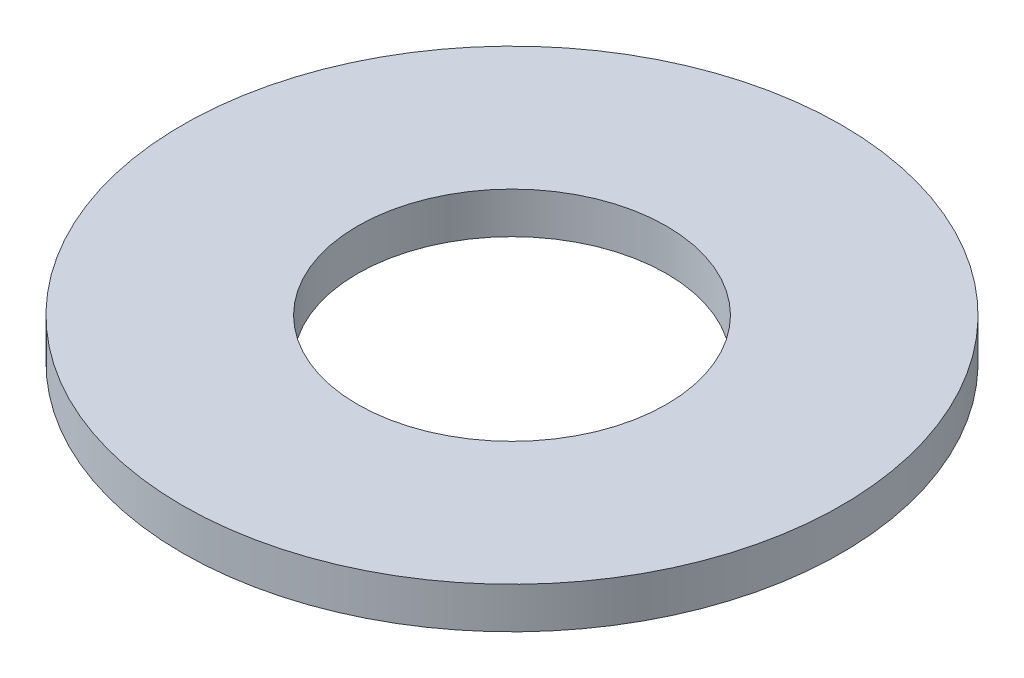
ISO-10303-21;
HEADER;
FILE_DESCRIPTION(('STEP AP214'),'2;1');
FILE_NAME('part.step','',(''),(''),'','','');
FILE_SCHEMA(('AUTOMOTIVE_DESIGN { 1 0 10303 214 1 1 1 1 }'));
ENDSEC;
DATA;
#1=APPLICATION_CONTEXT('core data for automotive mechanical design processes');
#2=APPLICATION_PROTOCOL_DEFINITION('international standard','automotive_design',2000,#1);
#3=PRODUCT_CONTEXT('',#1,'mechanical');
#4=PRODUCT('Part','Part','',(#3));
#5=PRODUCT_RELATED_PRODUCT_CATEGORY('part','',(#4));
#6=PRODUCT_DEFINITION_FORMATION('','',#4);
#7=PRODUCT_DEFINITION_CONTEXT('part definition',#1,'design');
#8=PRODUCT_DEFINITION('design','',#6,#7);
#9=PRODUCT_DEFINITION_SHAPE('','',#8);
#10=(LENGTH_UNIT() NAMED_UNIT(*) SI_UNIT(.MILLI.,.METRE.));
#11=(NAMED_UNIT(*) PLANE_ANGLE_UNIT() SI_UNIT($,.RADIAN.));
#12=(NAMED_UNIT(*) SI_UNIT($,.STERADIAN.) SOLID_ANGLE_UNIT());
#13=UNCERTAINTY_MEASURE_WITH_UNIT(LENGTH_MEASURE(1.E-05),#10,'distance_accuracy_value','');
#14=(GEOMETRIC_REPRESENTATION_CONTEXT(3) GLOBAL_UNCERTAINTY_ASSIGNED_CONTEXT((#13)) GLOBAL_UNIT_ASSIGNED_CONTEXT((#10,
#11,#12)) REPRESENTATION_CONTEXT('',''));
#15=CARTESIAN_POINT('',(0.,0.,0.));
#16=DIRECTION('',(0.,0.,1.));
#17=DIRECTION('',(1.,0.,0.));
#18=AXIS2_PLACEMENT_3D('',#15,#16,#17);
#19=CARTESIAN_POINT('',(0.,0.,0.));
#20=DIRECTION('',(0.,1.,0.));
#21=DIRECTION('',(0.,0.,1.));
#22=AXIS2_PLACEMENT_3D('',#19,#20,#21);
#23=PLANE('',#22);
#24=CARTESIAN_POINT('',(0.,0.,0.));
#25=DIRECTION('',(0.,-1.,0.));
#26=DIRECTION('',(0.,0.,-1.));
#27=AXIS2_PLACEMENT_3D('',#24,#25,#26);
#28=CIRCLE('',#27,1.875);
#29=CARTESIAN_POINT('',(0.,0.,-1.875));
#30=VERTEX_POINT('',#29);
#31=EDGE_CURVE('E27',#30,#30,#28,.F.);
#32=ORIENTED_EDGE('',*,*,#31,.T.);
#33=EDGE_LOOP('',(#32));
#34=FACE_BOUND('',#33,.T.);
#35=CARTESIAN_POINT('',(0.,0.,0.));
#36=DIRECTION('',(0.,-1.,0.));
#37=DIRECTION('',(0.,0.,-1.));
#38=AXIS2_PLACEMENT_3D('',#35,#36,#37);
#39=CIRCLE('',#38,4.);
#40=CARTESIAN_POINT('',(0.,0.,-4.));
#41=VERTEX_POINT('',#40);
#42=EDGE_CURVE('E18',#41,#41,#39,.F.);
#43=ORIENTED_EDGE('',*,*,#42,.F.);
#44=EDGE_LOOP('',(#43));
#45=FACE_BOUND('',#44,.T.);
#46=ADVANCED_FACE('F15',(#34,#45),#23,.F.);
#47=CARTESIAN_POINT('',(0.,0.5,0.));
#48=DIRECTION('',(0.,-1.,0.));
#49=DIRECTION('',(0.,0.,-1.));
#50=AXIS2_PLACEMENT_3D('',#47,#48,#49);
#51=CYLINDRICAL_SURFACE('',#50,4.);
#52=ORIENTED_EDGE('',*,*,#42,.T.);
#53=EDGE_LOOP('',(#52));
#54=FACE_BOUND('',#53,.T.);
#55=CARTESIAN_POINT('',(0.,0.5,0.));
#56=DIRECTION('',(0.,-1.,0.));
#57=DIRECTION('',(0.,0.,-1.));
#58=AXIS2_PLACEMENT_3D('',#55,#56,#57);
#59=CIRCLE('',#58,4.);
#60=CARTESIAN_POINT('',(0.,0.5,-4.));
#61=VERTEX_POINT('',#60);
#62=EDGE_CURVE('E22',#61,#61,#59,.F.);
#63=ORIENTED_EDGE('',*,*,#62,.F.);
#64=EDGE_LOOP('',(#63));
#65=FACE_BOUND('',#64,.T.);
#66=ADVANCED_FACE('F35',(#54,#65),#51,.T.);
#67=CARTESIAN_POINT('',(0.,0.5,0.));
#68=DIRECTION('',(0.,-1.,0.));
#69=DIRECTION('',(0.,0.,-1.));
#70=AXIS2_PLACEMENT_3D('',#67,#68,#69);
#71=CYLINDRICAL_SURFACE('',#70,1.875);
#72=CARTESIAN_POINT('',(0.,0.5,0.));
#73=DIRECTION('',(0.,-1.,0.));
#74=DIRECTION('',(0.,0.,-1.));
#75=AXIS2_PLACEMENT_3D('',#72,#73,#74);
#76=CIRCLE('',#75,1.875);
#77=CARTESIAN_POINT('',(0.,0.5,-1.875));
#78=VERTEX_POINT('',#77);
#79=EDGE_CURVE('E10',#78,#78,#76,.T.);
#80=ORIENTED_EDGE('',*,*,#79,.F.);
#81=EDGE_LOOP('',(#80));
#82=FACE_BOUND('',#81,.T.);
#83=ORIENTED_EDGE('',*,*,#31,.F.);
#84=EDGE_LOOP('',(#83));
#85=FACE_BOUND('',#84,.T.);
#86=ADVANCED_FACE('F43',(#82,#85),#71,.F.);
#87=CARTESIAN_POINT('',(0.,0.5,0.));
#88=DIRECTION('',(0.,1.,0.));
#89=DIRECTION('',(0.,0.,1.));
#90=AXIS2_PLACEMENT_3D('',#87,#88,#89);
#91=PLANE('',#90);
#92=ORIENTED_EDGE('',*,*,#79,.T.);
#93=EDGE_LOOP('',(#92));
#94=FACE_BOUND('',#93,.T.);
#95=ORIENTED_EDGE('',*,*,#62,.T.);
#96=EDGE_LOOP('',(#95));
#97=FACE_BOUND('',#96,.T.);
#98=ADVANCED_FACE('F44',(#94,#97),#91,.T.);
#99=CLOSED_SHELL('',(#46,#66,#86,#98));
#100=MANIFOLD_SOLID_BREP('B1',#99);
#101=ADVANCED_BREP_SHAPE_REPRESENTATION('',(#18,#100),#14);
#102=SHAPE_DEFINITION_REPRESENTATION(#9,#101);
ENDSEC;
END-ISO-10303-21;
